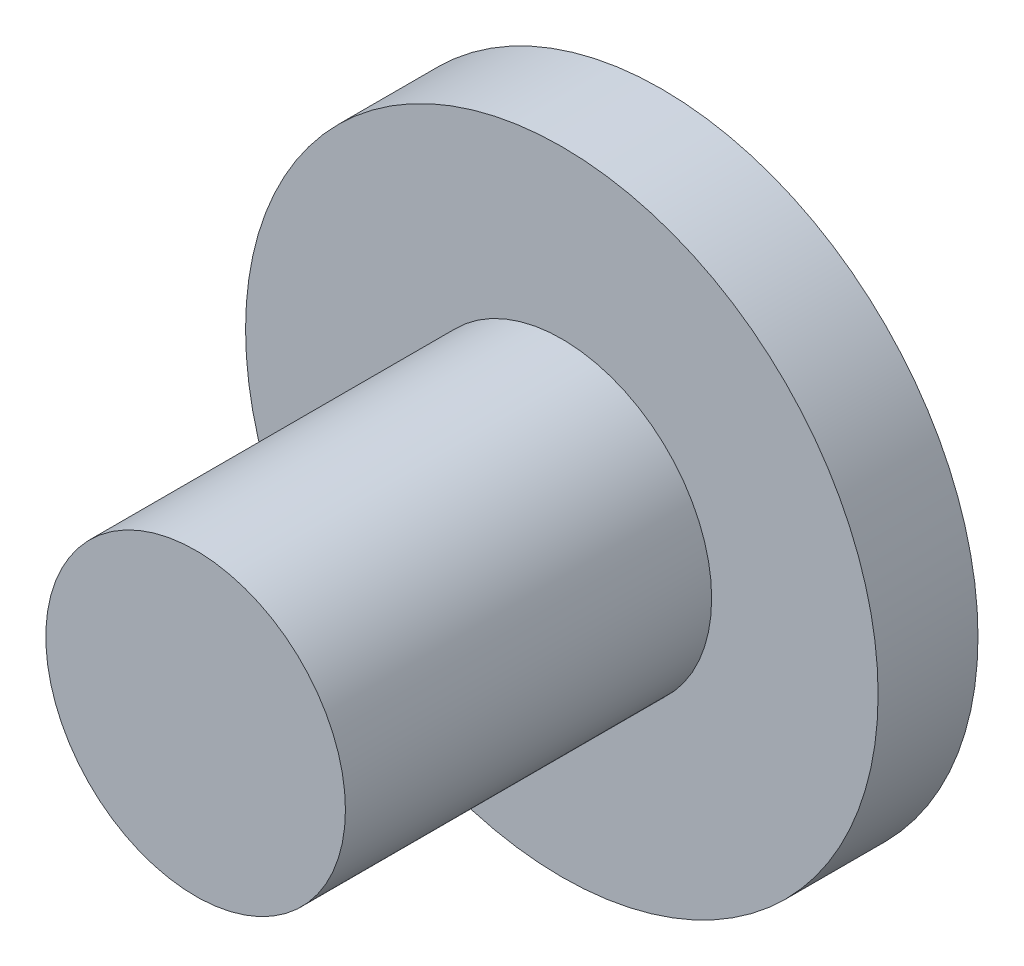
ISO-10303-21;
HEADER;
FILE_DESCRIPTION(('STEP AP214'),'2;1');
FILE_NAME('part.step','',(''),(''),'','','');
FILE_SCHEMA(('AUTOMOTIVE_DESIGN { 1 0 10303 214 1 1 1 1 }'));
ENDSEC;
DATA;
#1=APPLICATION_CONTEXT('core data for automotive mechanical design processes');
#2=APPLICATION_PROTOCOL_DEFINITION('international standard','automotive_design',2000,#1);
#3=PRODUCT_CONTEXT('',#1,'mechanical');
#4=PRODUCT('Part','Part','',(#3));
#5=PRODUCT_RELATED_PRODUCT_CATEGORY('part','',(#4));
#6=PRODUCT_DEFINITION_FORMATION('','',#4);
#7=PRODUCT_DEFINITION_CONTEXT('part definition',#1,'design');
#8=PRODUCT_DEFINITION('design','',#6,#7);
#9=PRODUCT_DEFINITION_SHAPE('','',#8);
#10=(LENGTH_UNIT() NAMED_UNIT(*) SI_UNIT(.MILLI.,.METRE.));
#11=(NAMED_UNIT(*) PLANE_ANGLE_UNIT() SI_UNIT($,.RADIAN.));
#12=(NAMED_UNIT(*) SI_UNIT($,.STERADIAN.) SOLID_ANGLE_UNIT());
#13=UNCERTAINTY_MEASURE_WITH_UNIT(LENGTH_MEASURE(1.E-05),#10,'distance_accuracy_value','');
#14=(GEOMETRIC_REPRESENTATION_CONTEXT(3) GLOBAL_UNCERTAINTY_ASSIGNED_CONTEXT((#13)) GLOBAL_UNIT_ASSIGNED_CONTEXT((#10,
#11,#12)) REPRESENTATION_CONTEXT('',''));
#15=CARTESIAN_POINT('',(0.,0.,0.));
#16=DIRECTION('',(0.,0.,1.));
#17=DIRECTION('',(1.,0.,0.));
#18=AXIS2_PLACEMENT_3D('',#15,#16,#17);
#19=CARTESIAN_POINT('',(0.,0.,1.50000000000003));
#20=DIRECTION('',(0.,0.,-1.));
#21=DIRECTION('',(-0.999999999999998,0.,0.));
#22=AXIS2_PLACEMENT_3D('',#19,#20,#21);
#23=CYLINDRICAL_SURFACE('',#22,4.75);
#24=CARTESIAN_POINT('',(0.,0.,1.50000000000003));
#25=DIRECTION('',(0.,0.,1.));
#26=DIRECTION('',(0.999999999999998,0.,0.));
#27=AXIS2_PLACEMENT_3D('',#24,#25,#26);
#28=CIRCLE('',#27,4.75);
#29=CARTESIAN_POINT('',(4.74999999999998,0.,1.50000000000002));
#30=VERTEX_POINT('',#29);
#31=EDGE_CURVE('E39',#30,#30,#28,.T.);
#32=ORIENTED_EDGE('',*,*,#31,.F.);
#33=EDGE_LOOP('',(#32));
#34=FACE_BOUND('',#33,.T.);
#35=CARTESIAN_POINT('',(0.,0.,0.));
#36=DIRECTION('',(0.,0.,1.));
#37=DIRECTION('',(0.999999999999998,0.,0.));
#38=AXIS2_PLACEMENT_3D('',#35,#36,#37);
#39=CIRCLE('',#38,4.75);
#40=CARTESIAN_POINT('',(4.74999999999999,0.,0.));
#41=VERTEX_POINT('',#40);
#42=EDGE_CURVE('E35',#41,#41,#39,.T.);
#43=ORIENTED_EDGE('',*,*,#42,.T.);
#44=EDGE_LOOP('',(#43));
#45=FACE_BOUND('',#44,.T.);
#46=ADVANCED_FACE('F32',(#34,#45),#23,.T.);
#47=CARTESIAN_POINT('',(0.,0.,1.50000000000003));
#48=DIRECTION('',(0.,0.,1.));
#49=DIRECTION('',(0.999999999999998,0.,0.));
#50=AXIS2_PLACEMENT_3D('',#47,#48,#49);
#51=PLANE('',#50);
#52=CARTESIAN_POINT('',(0.,0.,1.50000000000003));
#53=DIRECTION('',(0.,0.,1.));
#54=DIRECTION('',(0.999999999999998,0.,0.));
#55=AXIS2_PLACEMENT_3D('',#52,#53,#54);
#56=CIRCLE('',#55,2.25);
#57=CARTESIAN_POINT('',(2.24999999999998,0.,1.50000000000003));
#58=VERTEX_POINT('',#57);
#59=EDGE_CURVE('E10',#58,#58,#56,.T.);
#60=ORIENTED_EDGE('',*,*,#59,.F.);
#61=EDGE_LOOP('',(#60));
#62=FACE_BOUND('',#61,.T.);
#63=ORIENTED_EDGE('',*,*,#31,.T.);
#64=EDGE_LOOP('',(#63));
#65=FACE_BOUND('',#64,.T.);
#66=ADVANCED_FACE('F56',(#62,#65),#51,.T.);
#67=CARTESIAN_POINT('',(0.,0.,0.));
#68=DIRECTION('',(0.,0.,1.));
#69=DIRECTION('',(0.999999999999998,0.,0.));
#70=AXIS2_PLACEMENT_3D('',#67,#68,#69);
#71=PLANE('',#70);
#72=ORIENTED_EDGE('',*,*,#42,.F.);
#73=EDGE_LOOP('',(#72));
#74=FACE_BOUND('',#73,.T.);
#75=ADVANCED_FACE('F53',(#74),#71,.F.);
#76=CARTESIAN_POINT('',(0.,0.,7.00000000000003));
#77=DIRECTION('',(0.,0.,-1.));
#78=DIRECTION('',(-0.999999999999998,0.,0.));
#79=AXIS2_PLACEMENT_3D('',#76,#77,#78);
#80=CYLINDRICAL_SURFACE('',#79,2.25);
#81=CARTESIAN_POINT('',(0.,0.,7.00000000000003));
#82=DIRECTION('',(0.,0.,1.));
#83=DIRECTION('',(0.999999999999998,0.,0.));
#84=AXIS2_PLACEMENT_3D('',#81,#82,#83);
#85=CIRCLE('',#84,2.25);
#86=CARTESIAN_POINT('',(2.24999999999994,0.,7.00000000000003));
#87=VERTEX_POINT('',#86);
#88=EDGE_CURVE('E45',#87,#87,#85,.T.);
#89=ORIENTED_EDGE('',*,*,#88,.F.);
#90=EDGE_LOOP('',(#89));
#91=FACE_BOUND('',#90,.T.);
#92=ORIENTED_EDGE('',*,*,#59,.T.);
#93=EDGE_LOOP('',(#92));
#94=FACE_BOUND('',#93,.T.);
#95=ADVANCED_FACE('F55',(#91,#94),#80,.T.);
#96=CARTESIAN_POINT('',(0.,0.,7.00000000000003));
#97=DIRECTION('',(0.,0.,1.));
#98=DIRECTION('',(0.999999999999998,0.,0.));
#99=AXIS2_PLACEMENT_3D('',#96,#97,#98);
#100=PLANE('',#99);
#101=ORIENTED_EDGE('',*,*,#88,.T.);
#102=EDGE_LOOP('',(#101));
#103=FACE_BOUND('',#102,.T.);
#104=ADVANCED_FACE('F61',(#103),#100,.T.);
#105=CLOSED_SHELL('',(#46,#66,#75,#95,#104));
#106=MANIFOLD_SOLID_BREP('B2',#105);
#107=ADVANCED_BREP_SHAPE_REPRESENTATION('',(#18,#106),#14);
#108=SHAPE_DEFINITION_REPRESENTATION(#9,#107);
ENDSEC;
END-ISO-10303-21;
